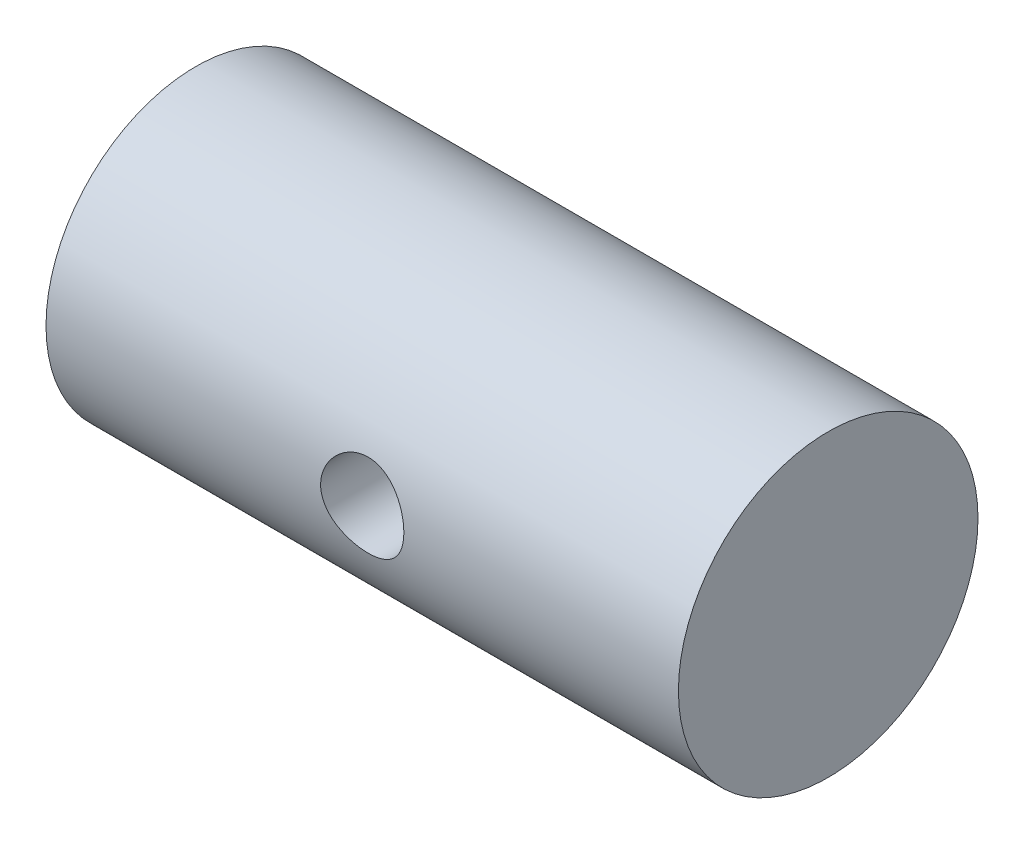
ISO-10303-21;
HEADER;
FILE_DESCRIPTION(('STEP AP214'),'2;1');
FILE_NAME('part.step','',(''),(''),'','','');
FILE_SCHEMA(('AUTOMOTIVE_DESIGN { 1 0 10303 214 1 1 1 1 }'));
ENDSEC;
DATA;
#1=APPLICATION_CONTEXT('core data for automotive mechanical design processes');
#2=APPLICATION_PROTOCOL_DEFINITION('international standard','automotive_design',2000,#1);
#3=PRODUCT_CONTEXT('',#1,'mechanical');
#4=PRODUCT('Part','Part','',(#3));
#5=PRODUCT_RELATED_PRODUCT_CATEGORY('part','',(#4));
#6=PRODUCT_DEFINITION_FORMATION('','',#4);
#7=PRODUCT_DEFINITION_CONTEXT('part definition',#1,'design');
#8=PRODUCT_DEFINITION('design','',#6,#7);
#9=PRODUCT_DEFINITION_SHAPE('','',#8);
#10=(LENGTH_UNIT() NAMED_UNIT(*) SI_UNIT(.MILLI.,.METRE.));
#11=(NAMED_UNIT(*) PLANE_ANGLE_UNIT() SI_UNIT($,.RADIAN.));
#12=(NAMED_UNIT(*) SI_UNIT($,.STERADIAN.) SOLID_ANGLE_UNIT());
#13=UNCERTAINTY_MEASURE_WITH_UNIT(LENGTH_MEASURE(1.E-05),#10,'distance_accuracy_value','');
#14=(GEOMETRIC_REPRESENTATION_CONTEXT(3) GLOBAL_UNCERTAINTY_ASSIGNED_CONTEXT((#13)) GLOBAL_UNIT_ASSIGNED_CONTEXT((#10,
#11,#12)) REPRESENTATION_CONTEXT('',''));
#15=CARTESIAN_POINT('',(0.,0.,0.));
#16=DIRECTION('',(0.,0.,1.));
#17=DIRECTION('',(1.,0.,0.));
#18=AXIS2_PLACEMENT_3D('',#15,#16,#17);
#19=CARTESIAN_POINT('',(38.,0.,0.));
#20=DIRECTION('',(-1.,0.,0.));
#21=DIRECTION('',(0.,0.,1.));
#22=AXIS2_PLACEMENT_3D('',#19,#20,#21);
#23=CYLINDRICAL_SURFACE('',#22,9.);
#24=CARTESIAN_POINT('',(38.,0.,0.));
#25=DIRECTION('',(1.,0.,0.));
#26=DIRECTION('',(0.,0.,-1.));
#27=AXIS2_PLACEMENT_3D('',#24,#25,#26);
#28=CIRCLE('',#27,9.);
#29=CARTESIAN_POINT('',(38.,0.,-9.));
#30=VERTEX_POINT('',#29);
#31=EDGE_CURVE('E10',#30,#30,#28,.T.);
#32=ORIENTED_EDGE('',*,*,#31,.F.);
#33=EDGE_LOOP('',(#32));
#34=FACE_BOUND('',#33,.T.);
#35=CARTESIAN_POINT('',(0.,0.,0.));
#36=DIRECTION('',(1.,0.,0.));
#37=DIRECTION('',(0.,0.,-1.));
#38=AXIS2_PLACEMENT_3D('',#35,#36,#37);
#39=CIRCLE('',#38,9.);
#40=CARTESIAN_POINT('',(0.,0.,-9.));
#41=VERTEX_POINT('',#40);
#42=EDGE_CURVE('E38',#41,#41,#39,.T.);
#43=ORIENTED_EDGE('',*,*,#42,.T.);
#44=EDGE_LOOP('',(#43));
#45=FACE_BOUND('',#44,.T.);
#46=CARTESIAN_POINT('',(21.5,0.,-9.));
#47=CARTESIAN_POINT('',(21.4999972008295,-0.137602501766358,-8.99999816033858));
#48=CARTESIAN_POINT('',(21.4886013603894,-0.275234247505334,-8.99681348173661));
#49=CARTESIAN_POINT('',(21.4434085434694,-0.546518951988477,-8.98441900396477));
#50=CARTESIAN_POINT('',(21.4096021165726,-0.680170207326879,-8.97520666298524));
#51=CARTESIAN_POINT('',(21.3207825611722,-0.939539899360603,-8.95177130789171));
#52=CARTESIAN_POINT('',(21.2657980626032,-1.06526878019134,-8.9375550606186));
#53=CARTESIAN_POINT('',(21.1362929873462,-1.30572139048355,-8.90560625164058));
#54=CARTESIAN_POINT('',(21.0617706761614,-1.4204441416246,-8.88787337777625));
#55=CARTESIAN_POINT('',(20.8933411323144,-1.63849356943183,-8.85030315634725));
#56=CARTESIAN_POINT('',(20.7990359206252,-1.7415062256169,-8.8304274724643));
#57=CARTESIAN_POINT('',(20.5945674457565,-1.93047637139272,-8.79105214235473));
#58=CARTESIAN_POINT('',(20.4844019554483,-2.01643146169124,-8.77155254937625));
#59=CARTESIAN_POINT('',(20.2487854797426,-2.1704161716063,-8.73474088585436));
#60=CARTESIAN_POINT('',(20.1230855831171,-2.23807749895612,-8.71747695878199));
#61=CARTESIAN_POINT('',(19.8615361647152,-2.35117914262341,-8.68765801630374));
#62=CARTESIAN_POINT('',(19.7256886991666,-2.39662394672714,-8.675102049999));
#63=CARTESIAN_POINT('',(19.4511944222944,-2.46289848736025,-8.65651766235508));
#64=CARTESIAN_POINT('',(19.3126963567531,-2.48430073808206,-8.65033771821211));
#65=CARTESIAN_POINT('',(19.0339482289146,-2.50366854155516,-8.644752985852));
#66=CARTESIAN_POINT('',(18.8936985302551,-2.50163888054626,-8.64534681401298));
#67=CARTESIAN_POINT('',(18.6199554425519,-2.4746534267536,-8.65310733650123));
#68=CARTESIAN_POINT('',(18.4863863970068,-2.45039804541374,-8.66007321349828));
#69=CARTESIAN_POINT('',(18.2252927428175,-2.38077462403778,-8.67947034094293));
#70=CARTESIAN_POINT('',(18.0977686547957,-2.33540476914306,-8.6919020611927));
#71=CARTESIAN_POINT('',(17.8505955370892,-2.22428746268939,-8.72100139554956));
#72=CARTESIAN_POINT('',(17.7310602663798,-2.15830043673984,-8.7377183720132));
#73=CARTESIAN_POINT('',(17.5045168488176,-2.00798881359268,-8.77347901367673));
#74=CARTESIAN_POINT('',(17.3975113625477,-1.9236603325812,-8.79252317128379));
#75=CARTESIAN_POINT('',(17.1950722391271,-1.73551122056889,-8.83162144253916));
#76=CARTESIAN_POINT('',(17.1001847302403,-1.63110455940471,-8.85168740075652));
#77=CARTESIAN_POINT('',(16.9291485384444,-1.40761321440207,-8.88996399621587));
#78=CARTESIAN_POINT('',(16.853000723795,-1.28852785084393,-8.90817454746904));
#79=CARTESIAN_POINT('',(16.7213363687399,-1.03816685867623,-8.94081679425529));
#80=CARTESIAN_POINT('',(16.6659257921222,-0.906832791495495,-8.95522897291068));
#81=CARTESIAN_POINT('',(16.5781318031173,-0.636219977539429,-8.97850985002887));
#82=CARTESIAN_POINT('',(16.5457429156869,-0.49694312824226,-8.98737986647399));
#83=CARTESIAN_POINT('',(16.505785726442,-0.219053215426284,-8.99837472966817));
#84=CARTESIAN_POINT('',(16.4974757101857,-0.080554611717363,-9.00070107648057));
#85=CARTESIAN_POINT('',(16.5038539965849,0.195859861273136,-8.99892960586322));
#86=CARTESIAN_POINT('',(16.5185397032961,0.33377579456904,-8.9948325135635));
#87=CARTESIAN_POINT('',(16.5698866682393,0.602413826941718,-8.98080530118042));
#88=CARTESIAN_POINT('',(16.606127890115,0.733222576327722,-8.97098674335106));
#89=CARTESIAN_POINT('',(16.6990637352762,0.986886236237455,-8.94663658338762));
#90=CARTESIAN_POINT('',(16.7557606651391,1.10974024794481,-8.93210444977129));
#91=CARTESIAN_POINT('',(16.8893317560929,1.34684028081078,-8.89947480568143));
#92=CARTESIAN_POINT('',(16.9666010486448,1.4608541239069,-8.88130942680351));
#93=CARTESIAN_POINT('',(17.1386322716154,1.67455534117418,-8.84350954257204));
#94=CARTESIAN_POINT('',(17.2333979601334,1.77423962926343,-8.82387472213289));
#95=CARTESIAN_POINT('',(17.4412028877548,1.95962405388921,-8.78459685365757));
#96=CARTESIAN_POINT('',(17.5547149031079,2.04479915770501,-8.76497216404559));
#97=CARTESIAN_POINT('',(17.7948412757667,2.1949116285828,-8.72859386619894));
#98=CARTESIAN_POINT('',(17.9214551317123,2.25984976965913,-8.71184014816766));
#99=CARTESIAN_POINT('',(18.1836143397486,2.36716211667702,-8.68329597870045));
#100=CARTESIAN_POINT('',(18.3191052754281,2.40966154966511,-8.67147806034821));
#101=CARTESIAN_POINT('',(18.5956994187438,2.47115304987672,-8.65415753646738));
#102=CARTESIAN_POINT('',(18.7368010292315,2.49015175812551,-8.64865314684267));
#103=CARTESIAN_POINT('',(19.0152115590136,2.50369719949209,-8.64474076665062));
#104=CARTESIAN_POINT('',(19.152476380069,2.49909142028599,-8.64608680814104));
#105=CARTESIAN_POINT('',(19.4241897876208,2.4675428657362,-8.65514273976249));
#106=CARTESIAN_POINT('',(19.5586384585411,2.4406007609873,-8.66285243883988));
#107=CARTESIAN_POINT('',(19.8197344678233,2.36565448497557,-8.68361437649823));
#108=CARTESIAN_POINT('',(19.9464416852921,2.31784429282322,-8.69661733835621));
#109=CARTESIAN_POINT('',(20.1901348450181,2.2026690334138,-8.72649832095034));
#110=CARTESIAN_POINT('',(20.3071191429723,2.13530066717352,-8.74337699532342));
#111=CARTESIAN_POINT('',(20.5320553056494,1.98041392404219,-8.77977621573303));
#112=CARTESIAN_POINT('',(20.6396029533652,1.8923241686926,-8.79936357965206));
#113=CARTESIAN_POINT('',(20.8386647441072,1.69956305490126,-8.83861663818042));
#114=CARTESIAN_POINT('',(20.930174905782,1.59488759125637,-8.85828235100436));
#115=CARTESIAN_POINT('',(21.0967162731561,1.36892046461578,-8.89603679163285));
#116=CARTESIAN_POINT('',(21.1713032466213,1.24729251786435,-8.91407682385634));
#117=CARTESIAN_POINT('',(21.298856278579,0.992723965385677,-8.94599949801159));
#118=CARTESIAN_POINT('',(21.351835037162,0.859790060353447,-8.95988458070659));
#119=CARTESIAN_POINT('',(21.4284401614694,0.6062909675334,-8.98032149663911));
#120=CARTESIAN_POINT('',(21.4552095751857,0.486728804337482,-8.98764491323713));
#121=CARTESIAN_POINT('',(21.4909896916451,0.244785251386818,-8.99748469952567));
#122=CARTESIAN_POINT('',(21.5000024899999,0.12240419603883,-9.00000163646935));
#123=CARTESIAN_POINT('',(21.5,0.,-9.));
#124=B_SPLINE_CURVE_WITH_KNOTS('',3,(#46,#47,#48,#49,#50,#51,#52,#53,#54,#55,#56,#57,#58,#59,
#60,#61,#62,#63,#64,#65,#66,#67,#68,#69,#70,#71,#72,#73,#74,#75,#76,#77,#78,#79,#80,#81,#82,#83,
#84,#85,#86,#87,#88,#89,#90,#91,#92,#93,#94,#95,#96,#97,#98,#99,#100,#101,#102,#103,#104,#105,
#106,#107,#108,#109,#110,#111,#112,#113,#114,#115,#116,#117,#118,#119,#120,#121,#122,#123),
.UNSPECIFIED.,.T.,.F.,(4,2,2,2,2,2,2,2,2,2,2,2,2,2,2,2,2,2,2,2,2,2,2,2,2,2,2,2,2,2,2,2,2,2,2,2,
2,2,4),(0.,0.412358386198981,0.824890772294521,1.23686741588571,1.64888064567586,
2.07015248650528,2.4914835408799,2.92075380647343,3.34993732266768,3.76866863882698,
4.18731442577045,4.59320465989601,4.99912978807063,5.40995920090068,5.82087569194106,
6.2463898768508,6.67192377325048,7.09960331280656,7.5271811070877,7.94144021185609,
8.35565255505711,8.76204634963729,9.16848598334834,9.58337897777209,9.99836119210684,
10.4261198341446,10.8538621134516,11.279191297197,11.7044002604958,12.114451985064,
12.5244913992549,12.9307978713245,13.3371729171665,13.7564382656794,14.1758075510164,
14.6051618118986,15.0342633576383,15.4011197307046,15.7679328052827),.UNSPECIFIED.);
#125=CARTESIAN_POINT('',(21.5,0.,-9.));
#126=VERTEX_POINT('',#125);
#127=EDGE_CURVE('E53',#126,#126,#124,.T.);
#128=ORIENTED_EDGE('',*,*,#127,.F.);
#129=EDGE_LOOP('',(#128));
#130=FACE_BOUND('',#129,.T.);
#131=CARTESIAN_POINT('',(16.5,0.,9.));
#132=CARTESIAN_POINT('',(16.5000027991705,0.137602501766358,8.99999816033858));
#133=CARTESIAN_POINT('',(16.5113986396106,0.275234247505334,8.99681348173661));
#134=CARTESIAN_POINT('',(16.5565914565306,0.546518951988477,8.98441900396477));
#135=CARTESIAN_POINT('',(16.5903978834274,0.680170207326879,8.97520666298524));
#136=CARTESIAN_POINT('',(16.6792174388278,0.939539899360602,8.95177130789171));
#137=CARTESIAN_POINT('',(16.7342019373968,1.06526878019134,8.9375550606186));
#138=CARTESIAN_POINT('',(16.8637070126538,1.30572139048355,8.90560625164058));
#139=CARTESIAN_POINT('',(16.9382293238386,1.4204441416246,8.88787337777625));
#140=CARTESIAN_POINT('',(17.1066588676856,1.63849356943183,8.85030315634725));
#141=CARTESIAN_POINT('',(17.2009640793748,1.7415062256169,8.8304274724643));
#142=CARTESIAN_POINT('',(17.4054325542435,1.93047637139272,8.79105214235473));
#143=CARTESIAN_POINT('',(17.5155980445517,2.01643146169124,8.77155254937625));
#144=CARTESIAN_POINT('',(17.7512145202574,2.1704161716063,8.73474088585436));
#145=CARTESIAN_POINT('',(17.8769144168829,2.23807749895613,8.71747695878199));
#146=CARTESIAN_POINT('',(18.1384638352848,2.35117914262341,8.68765801630374));
#147=CARTESIAN_POINT('',(18.2743113008334,2.39662394672714,8.675102049999));
#148=CARTESIAN_POINT('',(18.5488055777056,2.46289848736025,8.65651766235508));
#149=CARTESIAN_POINT('',(18.6873036432469,2.48430073808206,8.65033771821211));
#150=CARTESIAN_POINT('',(18.9660517710854,2.50366854155516,8.644752985852));
#151=CARTESIAN_POINT('',(19.1063014697449,2.50163888054626,8.64534681401298));
#152=CARTESIAN_POINT('',(19.3800445574481,2.4746534267536,8.65310733650123));
#153=CARTESIAN_POINT('',(19.5136136029931,2.45039804541374,8.66007321349828));
#154=CARTESIAN_POINT('',(19.7747072571825,2.38077462403778,8.67947034094293));
#155=CARTESIAN_POINT('',(19.9022313452043,2.33540476914306,8.6919020611927));
#156=CARTESIAN_POINT('',(20.1494044629108,2.22428746268939,8.72100139554956));
#157=CARTESIAN_POINT('',(20.2689397336202,2.15830043673984,8.7377183720132));
#158=CARTESIAN_POINT('',(20.4954831511824,2.00798881359268,8.77347901367673));
#159=CARTESIAN_POINT('',(20.6024886374523,1.9236603325812,8.79252317128379));
#160=CARTESIAN_POINT('',(20.8049277608728,1.73551122056889,8.83162144253916));
#161=CARTESIAN_POINT('',(20.8998152697597,1.63110455940472,8.85168740075652));
#162=CARTESIAN_POINT('',(21.0708514615556,1.40761321440207,8.88996399621587));
#163=CARTESIAN_POINT('',(21.146999276205,1.28852785084393,8.90817454746904));
#164=CARTESIAN_POINT('',(21.2786636312601,1.03816685867623,8.94081679425529));
#165=CARTESIAN_POINT('',(21.3340742078778,0.906832791495495,8.95522897291068));
#166=CARTESIAN_POINT('',(21.4218681968827,0.636219977539429,8.97850985002887));
#167=CARTESIAN_POINT('',(21.4542570843131,0.49694312824226,8.98737986647399));
#168=CARTESIAN_POINT('',(21.4942142735579,0.219053215426284,8.99837472966817));
#169=CARTESIAN_POINT('',(21.5025242898143,0.0805546117173629,9.00070107648057));
#170=CARTESIAN_POINT('',(21.4961460034151,-0.195859861273136,8.99892960586322));
#171=CARTESIAN_POINT('',(21.4814602967039,-0.33377579456904,8.9948325135635));
#172=CARTESIAN_POINT('',(21.4301133317607,-0.602413826941717,8.98080530118042));
#173=CARTESIAN_POINT('',(21.393872109885,-0.733222576327721,8.97098674335107));
#174=CARTESIAN_POINT('',(21.3009362647238,-0.986886236237455,8.94663658338763));
#175=CARTESIAN_POINT('',(21.2442393348609,-1.10974024794481,8.93210444977129));
#176=CARTESIAN_POINT('',(21.1106682439071,-1.34684028081078,8.89947480568143));
#177=CARTESIAN_POINT('',(21.0333989513552,-1.4608541239069,8.88130942680351));
#178=CARTESIAN_POINT('',(20.8613677283846,-1.67455534117418,8.84350954257204));
#179=CARTESIAN_POINT('',(20.7666020398666,-1.77423962926343,8.82387472213289));
#180=CARTESIAN_POINT('',(20.5587971122452,-1.95962405388921,8.78459685365757));
#181=CARTESIAN_POINT('',(20.4452850968921,-2.04479915770501,8.76497216404559));
#182=CARTESIAN_POINT('',(20.2051587242333,-2.1949116285828,8.72859386619894));
#183=CARTESIAN_POINT('',(20.0785448682877,-2.25984976965913,8.71184014816766));
#184=CARTESIAN_POINT('',(19.8163856602514,-2.36716211667702,8.68329597870045));
#185=CARTESIAN_POINT('',(19.6808947245719,-2.40966154966511,8.67147806034821));
#186=CARTESIAN_POINT('',(19.4043005812562,-2.47115304987672,8.65415753646738));
#187=CARTESIAN_POINT('',(19.2631989707685,-2.49015175812551,8.64865314684267));
#188=CARTESIAN_POINT('',(18.9847884409864,-2.50369719949209,8.64474076665062));
#189=CARTESIAN_POINT('',(18.847523619931,-2.49909142028599,8.64608680814104));
#190=CARTESIAN_POINT('',(18.5758102123792,-2.4675428657362,8.65514273976249));
#191=CARTESIAN_POINT('',(18.4413615414589,-2.4406007609873,8.66285243883988));
#192=CARTESIAN_POINT('',(18.1802655321767,-2.36565448497557,8.68361437649823));
#193=CARTESIAN_POINT('',(18.0535583147079,-2.31784429282322,8.69661733835621));
#194=CARTESIAN_POINT('',(17.8098651549819,-2.2026690334138,8.72649832095034));
#195=CARTESIAN_POINT('',(17.6928808570277,-2.13530066717352,8.74337699532342));
#196=CARTESIAN_POINT('',(17.4679446943506,-1.98041392404219,8.77977621573303));
#197=CARTESIAN_POINT('',(17.3603970466348,-1.8923241686926,8.79936357965206));
#198=CARTESIAN_POINT('',(17.1613352558928,-1.69956305490126,8.83861663818042));
#199=CARTESIAN_POINT('',(17.069825094218,-1.59488759125637,8.85828235100436));
#200=CARTESIAN_POINT('',(16.9032837268439,-1.36892046461578,8.89603679163285));
#201=CARTESIAN_POINT('',(16.8286967533787,-1.24729251786435,8.91407682385634));
#202=CARTESIAN_POINT('',(16.701143721421,-0.992723965385677,8.94599949801159));
#203=CARTESIAN_POINT('',(16.648164962838,-0.859790060353447,8.95988458070659));
#204=CARTESIAN_POINT('',(16.5715598385306,-0.6062909675334,8.98032149663911));
#205=CARTESIAN_POINT('',(16.5447904248143,-0.486728804337481,8.98764491323713));
#206=CARTESIAN_POINT('',(16.5090103083549,-0.244785251386817,8.99748469952567));
#207=CARTESIAN_POINT('',(16.4999975100001,-0.12240419603883,9.00000163646935));
#208=CARTESIAN_POINT('',(16.5,0.,9.));
#209=B_SPLINE_CURVE_WITH_KNOTS('',3,(#131,#132,#133,#134,#135,#136,#137,#138,#139,#140,#141,
#142,#143,#144,#145,#146,#147,#148,#149,#150,#151,#152,#153,#154,#155,#156,#157,#158,#159,#160,
#161,#162,#163,#164,#165,#166,#167,#168,#169,#170,#171,#172,#173,#174,#175,#176,#177,#178,#179,
#180,#181,#182,#183,#184,#185,#186,#187,#188,#189,#190,#191,#192,#193,#194,#195,#196,#197,#198,
#199,#200,#201,#202,#203,#204,#205,#206,#207,#208),.UNSPECIFIED.,.T.,.F.,(4,2,2,2,2,2,2,2,2,2,2,
2,2,2,2,2,2,2,2,2,2,2,2,2,2,2,2,2,2,2,2,2,2,2,2,2,2,2,4),(0.,0.412358386198981,
0.824890772294521,1.23686741588571,1.64888064567586,2.07015248650528,2.4914835408799,
2.92075380647343,3.34993732266768,3.76866863882698,4.18731442577045,4.59320465989601,
4.99912978807063,5.40995920090068,5.82087569194106,6.24638987685079,6.67192377325048,
7.09960331280656,7.5271811070877,7.94144021185609,8.35565255505711,8.76204634963729,
9.16848598334833,9.58337897777209,9.99836119210684,10.4261198341446,10.8538621134516,
11.279191297197,11.7044002604958,12.114451985064,12.5244913992549,12.9307978713245,
13.3371729171665,13.7564382656794,14.1758075510164,14.6051618118986,15.0342633576383,
15.4011197307046,15.7679328052827),.UNSPECIFIED.);
#210=CARTESIAN_POINT('',(16.5,0.,9.));
#211=VERTEX_POINT('',#210);
#212=EDGE_CURVE('E45',#211,#211,#209,.T.);
#213=ORIENTED_EDGE('',*,*,#212,.T.);
#214=EDGE_LOOP('',(#213));
#215=FACE_BOUND('',#214,.T.);
#216=ADVANCED_FACE('F35',(#34,#45,#130,#215),#23,.T.);
#217=CARTESIAN_POINT('',(38.,0.,0.));
#218=DIRECTION('',(1.,0.,0.));
#219=DIRECTION('',(0.,0.,-1.));
#220=AXIS2_PLACEMENT_3D('',#217,#218,#219);
#221=PLANE('',#220);
#222=ORIENTED_EDGE('',*,*,#31,.T.);
#223=EDGE_LOOP('',(#222));
#224=FACE_BOUND('',#223,.T.);
#225=ADVANCED_FACE('F67',(#224),#221,.T.);
#226=CARTESIAN_POINT('',(0.,0.,0.));
#227=DIRECTION('',(1.,0.,0.));
#228=DIRECTION('',(0.,0.,-1.));
#229=AXIS2_PLACEMENT_3D('',#226,#227,#228);
#230=PLANE('',#229);
#231=ORIENTED_EDGE('',*,*,#42,.F.);
#232=EDGE_LOOP('',(#231));
#233=FACE_BOUND('',#232,.T.);
#234=ADVANCED_FACE('F65',(#233),#230,.F.);
#235=CARTESIAN_POINT('',(19.,0.,9.001));
#236=DIRECTION('',(0.,0.,-1.));
#237=DIRECTION('',(-1.,0.,0.));
#238=AXIS2_PLACEMENT_3D('',#235,#236,#237);
#239=CYLINDRICAL_SURFACE('',#238,2.5);
#240=ORIENTED_EDGE('',*,*,#212,.F.);
#241=EDGE_LOOP('',(#240));
#242=FACE_BOUND('',#241,.T.);
#243=ORIENTED_EDGE('',*,*,#127,.T.);
#244=EDGE_LOOP('',(#243));
#245=FACE_BOUND('',#244,.T.);
#246=ADVANCED_FACE('F58',(#242,#245),#239,.F.);
#247=CLOSED_SHELL('',(#216,#225,#234,#246));
#248=MANIFOLD_SOLID_BREP('B2',#247);
#249=ADVANCED_BREP_SHAPE_REPRESENTATION('',(#18,#248),#14);
#250=SHAPE_DEFINITION_REPRESENTATION(#9,#249);
ENDSEC;
END-ISO-10303-21;
